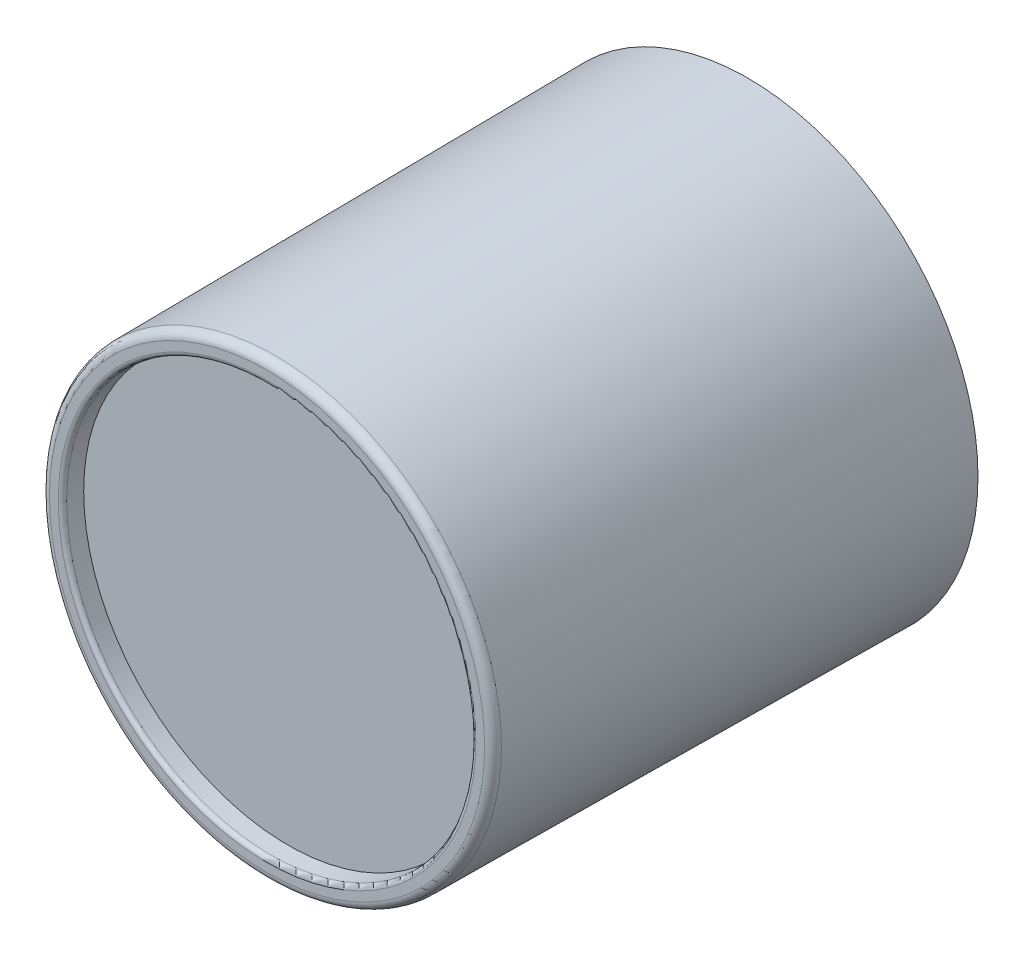
ISO-10303-21;
HEADER;
FILE_DESCRIPTION(('STEP AP214'),'2;1');
FILE_NAME('part.step','',(''),(''),'','','');
FILE_SCHEMA(('AUTOMOTIVE_DESIGN { 1 0 10303 214 1 1 1 1 }'));
ENDSEC;
DATA;
#1=APPLICATION_CONTEXT('core data for automotive mechanical design processes');
#2=APPLICATION_PROTOCOL_DEFINITION('international standard','automotive_design',2000,#1);
#3=PRODUCT_CONTEXT('',#1,'mechanical');
#4=PRODUCT('Part','Part','',(#3));
#5=PRODUCT_RELATED_PRODUCT_CATEGORY('part','',(#4));
#6=PRODUCT_DEFINITION_FORMATION('','',#4);
#7=PRODUCT_DEFINITION_CONTEXT('part definition',#1,'design');
#8=PRODUCT_DEFINITION('design','',#6,#7);
#9=PRODUCT_DEFINITION_SHAPE('','',#8);
#10=(LENGTH_UNIT() NAMED_UNIT(*) SI_UNIT(.MILLI.,.METRE.));
#11=(NAMED_UNIT(*) PLANE_ANGLE_UNIT() SI_UNIT($,.RADIAN.));
#12=(NAMED_UNIT(*) SI_UNIT($,.STERADIAN.) SOLID_ANGLE_UNIT());
#13=UNCERTAINTY_MEASURE_WITH_UNIT(LENGTH_MEASURE(1.E-05),#10,'distance_accuracy_value','');
#14=(GEOMETRIC_REPRESENTATION_CONTEXT(3) GLOBAL_UNCERTAINTY_ASSIGNED_CONTEXT((#13)) GLOBAL_UNIT_ASSIGNED_CONTEXT((#10,
#11,#12)) REPRESENTATION_CONTEXT('',''));
#15=CARTESIAN_POINT('',(0.,0.,0.));
#16=DIRECTION('',(0.,0.,1.));
#17=DIRECTION('',(1.,0.,0.));
#18=AXIS2_PLACEMENT_3D('',#15,#16,#17);
#19=CARTESIAN_POINT('',(0.,0.,72.6));
#20=DIRECTION('',(0.,0.,1.));
#21=DIRECTION('',(1.,0.,0.));
#22=AXIS2_PLACEMENT_3D('',#19,#20,#21);
#23=PLANE('',#22);
#24=CARTESIAN_POINT('',(0.,0.,72.6));
#25=DIRECTION('',(0.,0.,-1.));
#26=DIRECTION('',(-1.,0.,0.));
#27=AXIS2_PLACEMENT_3D('',#24,#25,#26);
#28=CIRCLE('',#27,23.6164293983909);
#29=CARTESIAN_POINT('',(23.6164293983909,0.,72.6));
#30=VERTEX_POINT('',#29);
#31=EDGE_CURVE('E94',#30,#30,#28,.T.);
#32=ORIENTED_EDGE('',*,*,#31,.T.);
#33=EDGE_LOOP('',(#32));
#34=FACE_BOUND('',#33,.T.);
#35=ADVANCED_FACE('F16',(#34),#23,.F.);
#36=CARTESIAN_POINT('',(0.,0.,28.));
#37=DIRECTION('',(0.,0.,-1.));
#38=DIRECTION('',(0.,-1.,0.));
#39=AXIS2_PLACEMENT_3D('',#36,#37,#38);
#40=PLANE('',#39);
#41=CARTESIAN_POINT('',(0.,0.,28.));
#42=DIRECTION('',(0.,0.,1.));
#43=DIRECTION('',(-1.,0.,0.));
#44=AXIS2_PLACEMENT_3D('',#41,#42,#43);
#45=CIRCLE('',#44,24.0056477018587);
#46=CARTESIAN_POINT('',(24.0056477018587,0.,28.));
#47=VERTEX_POINT('',#46);
#48=EDGE_CURVE('E129',#47,#47,#45,.T.);
#49=ORIENTED_EDGE('',*,*,#48,.T.);
#50=EDGE_LOOP('',(#49));
#51=FACE_BOUND('',#50,.T.);
#52=CARTESIAN_POINT('',(0.,0.,28.));
#53=DIRECTION('',(0.,0.,-1.));
#54=DIRECTION('',(-1.,0.,0.));
#55=AXIS2_PLACEMENT_3D('',#52,#53,#54);
#56=CIRCLE('',#55,25.);
#57=CARTESIAN_POINT('',(25.,0.,28.));
#58=VERTEX_POINT('',#57);
#59=EDGE_CURVE('E124',#58,#58,#56,.T.);
#60=ORIENTED_EDGE('',*,*,#59,.T.);
#61=EDGE_LOOP('',(#60));
#62=FACE_BOUND('',#61,.T.);
#63=ADVANCED_FACE('F213',(#51,#62),#40,.T.);
#64=CARTESIAN_POINT('',(0.,0.,74.6));
#65=DIRECTION('',(0.,0.,1.));
#66=DIRECTION('',(1.,0.,0.));
#67=AXIS2_PLACEMENT_3D('',#64,#65,#66);
#68=PLANE('',#67);
#69=CARTESIAN_POINT('',(0.,0.,74.6));
#70=DIRECTION('',(0.,0.,-1.));
#71=DIRECTION('',(-1.,0.,0.));
#72=AXIS2_PLACEMENT_3D('',#69,#70,#71);
#73=CIRCLE('',#72,24.272689856256);
#74=CARTESIAN_POINT('',(-24.272689856256,0.,74.6));
#75=VERTEX_POINT('',#74);
#76=EDGE_CURVE('E119',#75,#75,#73,.T.);
#77=ORIENTED_EDGE('',*,*,#76,.F.);
#78=EDGE_LOOP('',(#77));
#79=FACE_BOUND('',#78,.T.);
#80=ADVANCED_FACE('F218',(#79),#68,.T.);
#81=CARTESIAN_POINT('',(0.,-4.2247322763141E-13,77.1));
#82=DIRECTION('',(0.,0.,-1.));
#83=DIRECTION('',(0.,-1.,0.));
#84=AXIS2_PLACEMENT_3D('',#81,#82,#83);
#85=PLANE('',#84);
#86=CARTESIAN_POINT('',(0.,0.,77.1));
#87=DIRECTION('',(0.,0.,-1.));
#88=DIRECTION('',(-1.,0.,0.));
#89=AXIS2_PLACEMENT_3D('',#86,#87,#88);
#90=CIRCLE('',#89,24.7901626310303);
#91=CARTESIAN_POINT('',(24.7901626310303,0.,77.1));
#92=VERTEX_POINT('',#91);
#93=EDGE_CURVE('E101',#92,#92,#90,.T.);
#94=ORIENTED_EDGE('',*,*,#93,.T.);
#95=EDGE_LOOP('',(#94));
#96=FACE_BOUND('',#95,.T.);
#97=CARTESIAN_POINT('',(0.,0.,77.1));
#98=DIRECTION('',(0.,0.,1.));
#99=DIRECTION('',(-1.,0.,0.));
#100=AXIS2_PLACEMENT_3D('',#97,#98,#99);
#101=CIRCLE('',#100,25.8358472827381);
#102=CARTESIAN_POINT('',(25.8358472827381,0.,77.1));
#103=VERTEX_POINT('',#102);
#104=EDGE_CURVE('E122',#103,#103,#101,.T.);
#105=ORIENTED_EDGE('',*,*,#104,.T.);
#106=EDGE_LOOP('',(#105));
#107=FACE_BOUND('',#106,.T.);
#108=ADVANCED_FACE('F227',(#96,#107),#85,.F.);
#109=CARTESIAN_POINT('',(0.,0.,20.));
#110=DIRECTION('',(0.,0.,1.));
#111=DIRECTION('',(1.,0.,0.));
#112=AXIS2_PLACEMENT_3D('',#109,#110,#111);
#113=PLANE('',#112);
#114=CARTESIAN_POINT('',(0.,0.,20.));
#115=DIRECTION('',(0.,0.,-1.));
#116=DIRECTION('',(-1.,0.,0.));
#117=AXIS2_PLACEMENT_3D('',#114,#115,#116);
#118=CIRCLE('',#117,25.);
#119=CARTESIAN_POINT('',(25.,0.,20.));
#120=VERTEX_POINT('',#119);
#121=EDGE_CURVE('E75',#120,#120,#118,.T.);
#122=ORIENTED_EDGE('',*,*,#121,.F.);
#123=EDGE_LOOP('',(#122));
#124=FACE_BOUND('',#123,.T.);
#125=CARTESIAN_POINT('',(0.,0.,20.));
#126=DIRECTION('',(0.,0.,-1.));
#127=DIRECTION('',(1.,0.,0.));
#128=AXIS2_PLACEMENT_3D('',#125,#126,#127);
#129=CIRCLE('',#128,27.325462644185);
#130=CARTESIAN_POINT('',(27.325462644185,0.,20.));
#131=VERTEX_POINT('',#130);
#132=EDGE_CURVE('E27',#131,#131,#129,.T.);
#133=ORIENTED_EDGE('',*,*,#132,.T.);
#134=EDGE_LOOP('',(#133));
#135=FACE_BOUND('',#134,.T.);
#136=ADVANCED_FACE('F223',(#124,#135),#113,.F.);
#137=CARTESIAN_POINT('',(0.,0.,0.));
#138=DIRECTION('',(0.,0.,-1.));
#139=DIRECTION('',(-1.,0.,0.));
#140=AXIS2_PLACEMENT_3D('',#137,#138,#139);
#141=CONICAL_SURFACE('',#140,27.5,0.00872664625996925);
#142=ORIENTED_EDGE('',*,*,#132,.F.);
#143=DIRECTION('',(-0.00872653549836688,0.,0.999961923064171));
#144=VECTOR('',#143,1.);
#145=CARTESIAN_POINT('',(27.5,0.,0.));
#146=LINE('',#145,#144);
#147=CARTESIAN_POINT('',(26.8358092058022,0.,76.1087265354984));
#148=VERTEX_POINT('',#147);
#149=EDGE_CURVE('E10',#131,#148,#146,.T.);
#150=ORIENTED_EDGE('',*,*,#149,.T.);
#151=CARTESIAN_POINT('',(0.,0.,76.1087265354984));
#152=DIRECTION('',(0.,0.,-1.));
#153=DIRECTION('',(-1.,0.,0.));
#154=AXIS2_PLACEMENT_3D('',#151,#152,#153);
#155=CIRCLE('',#154,26.8358092058022);
#156=EDGE_CURVE('E114',#148,#148,#155,.T.);
#157=ORIENTED_EDGE('',*,*,#156,.T.);
#158=ORIENTED_EDGE('',*,*,#149,.F.);
#159=EDGE_LOOP('',(#142,#150,#157,#158));
#160=FACE_BOUND('',#159,.T.);
#161=ADVANCED_FACE('F226',(#160),#141,.T.);
#162=CARTESIAN_POINT('',(0.,0.,74.6));
#163=DIRECTION('',(0.,0.,1.));
#164=DIRECTION('',(1.,0.,0.));
#165=AXIS2_PLACEMENT_3D('',#162,#163,#164);
#166=CONICAL_SURFACE('',#165,24.272689856256,0.00872664625996925);
#167=ORIENTED_EDGE('',*,*,#76,.T.);
#168=DIRECTION('',(-0.00872653549836622,0.,0.999961923064171));
#169=VECTOR('',#168,1.);
#170=CARTESIAN_POINT('',(-24.272689856256,0.,74.6));
#171=LINE('',#170,#169);
#172=CARTESIAN_POINT('',(-24.2901816694982,0.,76.6043632677493));
#173=VERTEX_POINT('',#172);
#174=EDGE_CURVE('E98',#75,#173,#171,.T.);
#175=ORIENTED_EDGE('',*,*,#174,.T.);
#176=CARTESIAN_POINT('',(0.,0.,76.6043632677493));
#177=DIRECTION('',(0.,0.,1.));
#178=DIRECTION('',(-1.,0.,0.));
#179=AXIS2_PLACEMENT_3D('',#176,#177,#178);
#180=CIRCLE('',#179,24.2901816694982);
#181=CARTESIAN_POINT('',(24.2901816694982,0.,76.6043632677493));
#182=VERTEX_POINT('',#181);
#183=EDGE_CURVE('E91',#173,#182,#180,.T.);
#184=ORIENTED_EDGE('',*,*,#183,.T.);
#185=CARTESIAN_POINT('',(0.,0.,76.6043632677493));
#186=DIRECTION('',(0.,0.,1.));
#187=DIRECTION('',(-1.,0.,0.));
#188=AXIS2_PLACEMENT_3D('',#185,#186,#187);
#189=CIRCLE('',#188,24.2901816694982);
#190=EDGE_CURVE('E84',#182,#173,#189,.T.);
#191=ORIENTED_EDGE('',*,*,#190,.T.);
#192=ORIENTED_EDGE('',*,*,#174,.F.);
#193=EDGE_LOOP('',(#167,#175,#184,#191,#192));
#194=FACE_BOUND('',#193,.T.);
#195=ADVANCED_FACE('F97',(#194),#166,.F.);
#196=CARTESIAN_POINT('',(0.,0.,76.1));
#197=DIRECTION('',(0.,0.,-1.));
#198=DIRECTION('',(-1.,0.,0.));
#199=AXIS2_PLACEMENT_3D('',#196,#197,#198);
#200=TOROIDAL_SURFACE('',#199,25.8358472827381,1.);
#201=ORIENTED_EDGE('',*,*,#156,.F.);
#202=CARTESIAN_POINT('',(25.8358472827381,0.,76.1));
#203=DIRECTION('',(0.,-1.,0.));
#204=DIRECTION('',(1.,0.,0.));
#205=AXIS2_PLACEMENT_3D('',#202,#203,#204);
#206=CIRCLE('',#205,1.);
#207=EDGE_CURVE('E20',#148,#103,#206,.T.);
#208=ORIENTED_EDGE('',*,*,#207,.T.);
#209=ORIENTED_EDGE('',*,*,#104,.F.);
#210=ORIENTED_EDGE('',*,*,#207,.F.);
#211=EDGE_LOOP('',(#201,#208,#209,#210));
#212=FACE_BOUND('',#211,.T.);
#213=ADVANCED_FACE('F210',(#212),#200,.T.);
#214=CARTESIAN_POINT('',(0.,0.,28.));
#215=DIRECTION('',(0.,0.,-1.));
#216=DIRECTION('',(-1.,0.,0.));
#217=AXIS2_PLACEMENT_3D('',#214,#215,#216);
#218=CYLINDRICAL_SURFACE('',#217,25.);
#219=ORIENTED_EDGE('',*,*,#59,.F.);
#220=DIRECTION('',(0.,0.,-1.));
#221=VECTOR('',#220,1.);
#222=CARTESIAN_POINT('',(25.,0.,28.));
#223=LINE('',#222,#221);
#224=EDGE_CURVE('E115',#58,#120,#223,.T.);
#225=ORIENTED_EDGE('',*,*,#224,.T.);
#226=ORIENTED_EDGE('',*,*,#121,.T.);
#227=ORIENTED_EDGE('',*,*,#224,.F.);
#228=EDGE_LOOP('',(#219,#225,#226,#227));
#229=FACE_BOUND('',#228,.T.);
#230=ADVANCED_FACE('F203',(#229),#218,.F.);
#231=CARTESIAN_POINT('',(0.,0.,0.));
#232=DIRECTION('',(0.,0.,-1.));
#233=DIRECTION('',(-1.,0.,0.));
#234=AXIS2_PLACEMENT_3D('',#231,#232,#233);
#235=CONICAL_SURFACE('',#234,24.25,0.00872664625996925);
#236=ORIENTED_EDGE('',*,*,#31,.F.);
#237=DIRECTION('',(0.00872653549837466,0.,-0.999961923064171));
#238=VECTOR('',#237,1.);
#239=CARTESIAN_POINT('',(24.25,0.,0.));
#240=LINE('',#239,#238);
#241=EDGE_CURVE('E110',#30,#47,#240,.T.);
#242=ORIENTED_EDGE('',*,*,#241,.T.);
#243=ORIENTED_EDGE('',*,*,#48,.F.);
#244=ORIENTED_EDGE('',*,*,#241,.F.);
#245=EDGE_LOOP('',(#236,#242,#243,#244));
#246=FACE_BOUND('',#245,.T.);
#247=ADVANCED_FACE('F18',(#246),#235,.F.);
#248=CARTESIAN_POINT('',(0.,0.,76.6));
#249=DIRECTION('',(0.,0.,-1.));
#250=DIRECTION('',(-1.,0.,0.));
#251=AXIS2_PLACEMENT_3D('',#248,#249,#250);
#252=TOROIDAL_SURFACE('',#251,24.7901626310303,0.5);
#253=ORIENTED_EDGE('',*,*,#93,.F.);
#254=CARTESIAN_POINT('',(24.7901626310303,0.,76.6));
#255=DIRECTION('',(0.,-1.,0.));
#256=DIRECTION('',(1.,0.,0.));
#257=AXIS2_PLACEMENT_3D('',#254,#255,#256);
#258=CIRCLE('',#257,0.5);
#259=EDGE_CURVE('E89',#92,#182,#258,.T.);
#260=ORIENTED_EDGE('',*,*,#259,.T.);
#261=ORIENTED_EDGE('',*,*,#183,.F.);
#262=ORIENTED_EDGE('',*,*,#190,.F.);
#263=ORIENTED_EDGE('',*,*,#259,.F.);
#264=EDGE_LOOP('',(#253,#260,#261,#262,#263));
#265=FACE_BOUND('',#264,.T.);
#266=ADVANCED_FACE('F87',(#265),#252,.T.);
#267=CLOSED_SHELL('',(#35,#63,#80,#108,#136,#161,#195,#213,#230,#247,#266));
#268=MANIFOLD_SOLID_BREP('B1',#267);
#269=ADVANCED_BREP_SHAPE_REPRESENTATION('',(#18,#268),#14);
#270=SHAPE_DEFINITION_REPRESENTATION(#9,#269);
ENDSEC;
END-ISO-10303-21;
